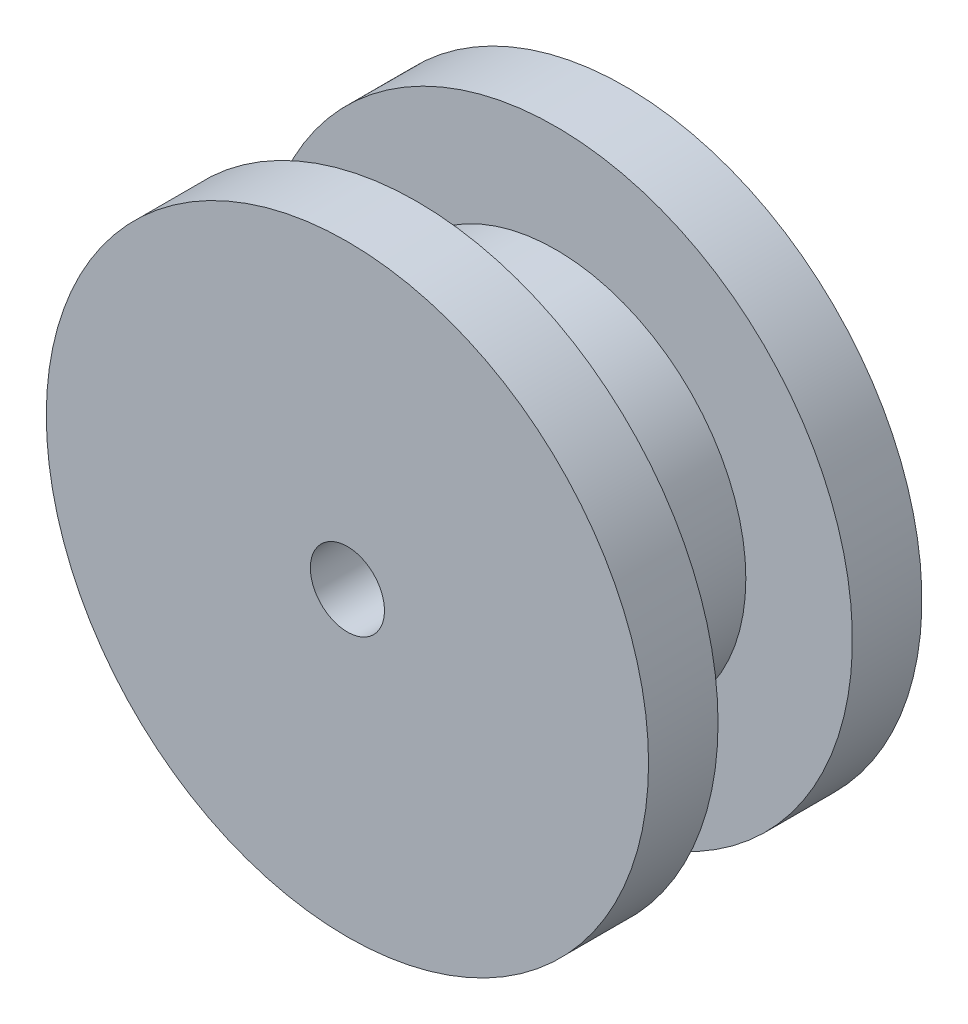
ISO-10303-21;
HEADER;
FILE_DESCRIPTION(('STEP AP214'),'2;1');
FILE_NAME('part.step','',(''),(''),'','','');
FILE_SCHEMA(('AUTOMOTIVE_DESIGN { 1 0 10303 214 1 1 1 1 }'));
ENDSEC;
DATA;
#1=APPLICATION_CONTEXT('core data for automotive mechanical design processes');
#2=APPLICATION_PROTOCOL_DEFINITION('international standard','automotive_design',2000,#1);
#3=PRODUCT_CONTEXT('',#1,'mechanical');
#4=PRODUCT('Part','Part','',(#3));
#5=PRODUCT_RELATED_PRODUCT_CATEGORY('part','',(#4));
#6=PRODUCT_DEFINITION_FORMATION('','',#4);
#7=PRODUCT_DEFINITION_CONTEXT('part definition',#1,'design');
#8=PRODUCT_DEFINITION('design','',#6,#7);
#9=PRODUCT_DEFINITION_SHAPE('','',#8);
#10=(LENGTH_UNIT() NAMED_UNIT(*) SI_UNIT(.MILLI.,.METRE.));
#11=(NAMED_UNIT(*) PLANE_ANGLE_UNIT() SI_UNIT($,.RADIAN.));
#12=(NAMED_UNIT(*) SI_UNIT($,.STERADIAN.) SOLID_ANGLE_UNIT());
#13=UNCERTAINTY_MEASURE_WITH_UNIT(LENGTH_MEASURE(1.E-05),#10,'distance_accuracy_value','');
#14=(GEOMETRIC_REPRESENTATION_CONTEXT(3) GLOBAL_UNCERTAINTY_ASSIGNED_CONTEXT((#13)) GLOBAL_UNIT_ASSIGNED_CONTEXT((#10,
#11,#12)) REPRESENTATION_CONTEXT('',''));
#15=CARTESIAN_POINT('',(0.,0.,0.));
#16=DIRECTION('',(0.,0.,1.));
#17=DIRECTION('',(1.,0.,0.));
#18=AXIS2_PLACEMENT_3D('',#15,#16,#17);
#19=CARTESIAN_POINT('',(0.,0.,15.));
#20=DIRECTION('',(0.,0.,-1.));
#21=DIRECTION('',(-1.,0.,0.));
#22=AXIS2_PLACEMENT_3D('',#19,#20,#21);
#23=CYLINDRICAL_SURFACE('',#22,20.5);
#24=CARTESIAN_POINT('',(0.,0.,15.));
#25=DIRECTION('',(0.,0.,1.));
#26=DIRECTION('',(1.,0.,0.));
#27=AXIS2_PLACEMENT_3D('',#24,#25,#26);
#28=CIRCLE('',#27,20.5);
#29=CARTESIAN_POINT('',(20.5,0.,15.));
#30=VERTEX_POINT('',#29);
#31=EDGE_CURVE('E10',#30,#30,#28,.T.);
#32=ORIENTED_EDGE('',*,*,#31,.F.);
#33=EDGE_LOOP('',(#32));
#34=FACE_BOUND('',#33,.T.);
#35=CARTESIAN_POINT('',(0.,0.,0.));
#36=DIRECTION('',(0.,0.,1.));
#37=DIRECTION('',(1.,0.,0.));
#38=AXIS2_PLACEMENT_3D('',#35,#36,#37);
#39=CIRCLE('',#38,20.5);
#40=CARTESIAN_POINT('',(20.5,0.,0.));
#41=VERTEX_POINT('',#40);
#42=EDGE_CURVE('E37',#41,#41,#39,.T.);
#43=ORIENTED_EDGE('',*,*,#42,.T.);
#44=EDGE_LOOP('',(#43));
#45=FACE_BOUND('',#44,.T.);
#46=ADVANCED_FACE('F34',(#34,#45),#23,.T.);
#47=CARTESIAN_POINT('',(0.,0.,22.5));
#48=DIRECTION('',(0.,0.,-1.));
#49=DIRECTION('',(-1.,0.,0.));
#50=AXIS2_PLACEMENT_3D('',#47,#48,#49);
#51=CYLINDRICAL_SURFACE('',#50,32.5);
#52=CARTESIAN_POINT('',(0.,0.,22.5));
#53=DIRECTION('',(0.,0.,1.));
#54=DIRECTION('',(1.,0.,0.));
#55=AXIS2_PLACEMENT_3D('',#52,#53,#54);
#56=CIRCLE('',#55,32.5);
#57=CARTESIAN_POINT('',(32.5,0.,22.5));
#58=VERTEX_POINT('',#57);
#59=EDGE_CURVE('E41',#58,#58,#56,.T.);
#60=ORIENTED_EDGE('',*,*,#59,.F.);
#61=EDGE_LOOP('',(#60));
#62=FACE_BOUND('',#61,.T.);
#63=CARTESIAN_POINT('',(0.,0.,15.));
#64=DIRECTION('',(0.,0.,1.));
#65=DIRECTION('',(1.,0.,0.));
#66=AXIS2_PLACEMENT_3D('',#63,#64,#65);
#67=CIRCLE('',#66,32.5);
#68=CARTESIAN_POINT('',(32.5,0.,15.));
#69=VERTEX_POINT('',#68);
#70=EDGE_CURVE('E45',#69,#69,#67,.T.);
#71=ORIENTED_EDGE('',*,*,#70,.T.);
#72=EDGE_LOOP('',(#71));
#73=FACE_BOUND('',#72,.T.);
#74=ADVANCED_FACE('F93',(#62,#73),#51,.T.);
#75=CARTESIAN_POINT('',(0.,0.,22.5));
#76=DIRECTION('',(0.,0.,1.));
#77=DIRECTION('',(1.,0.,0.));
#78=AXIS2_PLACEMENT_3D('',#75,#76,#77);
#79=PLANE('',#78);
#80=CARTESIAN_POINT('',(0.,0.,22.5));
#81=DIRECTION('',(0.,0.,-1.));
#82=DIRECTION('',(-1.,0.,0.));
#83=AXIS2_PLACEMENT_3D('',#80,#81,#82);
#84=CIRCLE('',#83,4.);
#85=CARTESIAN_POINT('',(-4.,0.,22.5));
#86=VERTEX_POINT('',#85);
#87=EDGE_CURVE('E54',#86,#86,#84,.T.);
#88=ORIENTED_EDGE('',*,*,#87,.T.);
#89=EDGE_LOOP('',(#88));
#90=FACE_BOUND('',#89,.T.);
#91=ORIENTED_EDGE('',*,*,#59,.T.);
#92=EDGE_LOOP('',(#91));
#93=FACE_BOUND('',#92,.T.);
#94=ADVANCED_FACE('F63',(#90,#93),#79,.T.);
#95=CARTESIAN_POINT('',(0.,0.,15.));
#96=DIRECTION('',(0.,0.,1.));
#97=DIRECTION('',(1.,0.,0.));
#98=AXIS2_PLACEMENT_3D('',#95,#96,#97);
#99=PLANE('',#98);
#100=ORIENTED_EDGE('',*,*,#31,.T.);
#101=EDGE_LOOP('',(#100));
#102=FACE_BOUND('',#101,.T.);
#103=ORIENTED_EDGE('',*,*,#70,.F.);
#104=EDGE_LOOP('',(#103));
#105=FACE_BOUND('',#104,.T.);
#106=ADVANCED_FACE('F82',(#102,#105),#99,.F.);
#107=CARTESIAN_POINT('',(0.,0.,-7.5));
#108=DIRECTION('',(0.,0.,1.));
#109=DIRECTION('',(1.,0.,0.));
#110=AXIS2_PLACEMENT_3D('',#107,#108,#109);
#111=CYLINDRICAL_SURFACE('',#110,32.);
#112=CARTESIAN_POINT('',(0.,0.,-7.5));
#113=DIRECTION('',(0.,0.,-1.));
#114=DIRECTION('',(-1.,0.,0.));
#115=AXIS2_PLACEMENT_3D('',#112,#113,#114);
#116=CIRCLE('',#115,32.);
#117=CARTESIAN_POINT('',(-32.,0.,-7.5));
#118=VERTEX_POINT('',#117);
#119=EDGE_CURVE('E53',#118,#118,#116,.T.);
#120=ORIENTED_EDGE('',*,*,#119,.F.);
#121=EDGE_LOOP('',(#120));
#122=FACE_BOUND('',#121,.T.);
#123=CARTESIAN_POINT('',(0.,0.,0.));
#124=DIRECTION('',(0.,0.,-1.));
#125=DIRECTION('',(-1.,0.,0.));
#126=AXIS2_PLACEMENT_3D('',#123,#124,#125);
#127=CIRCLE('',#126,32.);
#128=CARTESIAN_POINT('',(-32.,0.,0.));
#129=VERTEX_POINT('',#128);
#130=EDGE_CURVE('E50',#129,#129,#127,.T.);
#131=ORIENTED_EDGE('',*,*,#130,.T.);
#132=EDGE_LOOP('',(#131));
#133=FACE_BOUND('',#132,.T.);
#134=ADVANCED_FACE('F76',(#122,#133),#111,.T.);
#135=CARTESIAN_POINT('',(0.,0.,-7.5));
#136=DIRECTION('',(0.,0.,-1.));
#137=DIRECTION('',(-1.,0.,0.));
#138=AXIS2_PLACEMENT_3D('',#135,#136,#137);
#139=PLANE('',#138);
#140=CARTESIAN_POINT('',(0.,0.,-7.5));
#141=DIRECTION('',(0.,0.,-1.));
#142=DIRECTION('',(-1.,0.,0.));
#143=AXIS2_PLACEMENT_3D('',#140,#141,#142);
#144=CIRCLE('',#143,4.);
#145=CARTESIAN_POINT('',(-4.,0.,-7.5));
#146=VERTEX_POINT('',#145);
#147=EDGE_CURVE('E57',#146,#146,#144,.T.);
#148=ORIENTED_EDGE('',*,*,#147,.F.);
#149=EDGE_LOOP('',(#148));
#150=FACE_BOUND('',#149,.T.);
#151=ORIENTED_EDGE('',*,*,#119,.T.);
#152=EDGE_LOOP('',(#151));
#153=FACE_BOUND('',#152,.T.);
#154=ADVANCED_FACE('F73',(#150,#153),#139,.T.);
#155=CARTESIAN_POINT('',(0.,0.,0.));
#156=DIRECTION('',(0.,0.,-1.));
#157=DIRECTION('',(-1.,0.,0.));
#158=AXIS2_PLACEMENT_3D('',#155,#156,#157);
#159=PLANE('',#158);
#160=ORIENTED_EDGE('',*,*,#42,.F.);
#161=EDGE_LOOP('',(#160));
#162=FACE_BOUND('',#161,.T.);
#163=ORIENTED_EDGE('',*,*,#130,.F.);
#164=EDGE_LOOP('',(#163));
#165=FACE_BOUND('',#164,.T.);
#166=ADVANCED_FACE('F69',(#162,#165),#159,.F.);
#167=CARTESIAN_POINT('',(0.,0.,22.5));
#168=DIRECTION('',(0.,0.,-1.));
#169=DIRECTION('',(-1.,0.,0.));
#170=AXIS2_PLACEMENT_3D('',#167,#168,#169);
#171=CYLINDRICAL_SURFACE('',#170,4.);
#172=ORIENTED_EDGE('',*,*,#87,.F.);
#173=EDGE_LOOP('',(#172));
#174=FACE_BOUND('',#173,.T.);
#175=ORIENTED_EDGE('',*,*,#147,.T.);
#176=EDGE_LOOP('',(#175));
#177=FACE_BOUND('',#176,.T.);
#178=ADVANCED_FACE('F66',(#174,#177),#171,.F.);
#179=CLOSED_SHELL('',(#46,#74,#94,#106,#134,#154,#166,#178));
#180=MANIFOLD_SOLID_BREP('B2',#179);
#181=ADVANCED_BREP_SHAPE_REPRESENTATION('',(#18,#180),#14);
#182=SHAPE_DEFINITION_REPRESENTATION(#9,#181);
ENDSEC;
END-ISO-10303-21;
